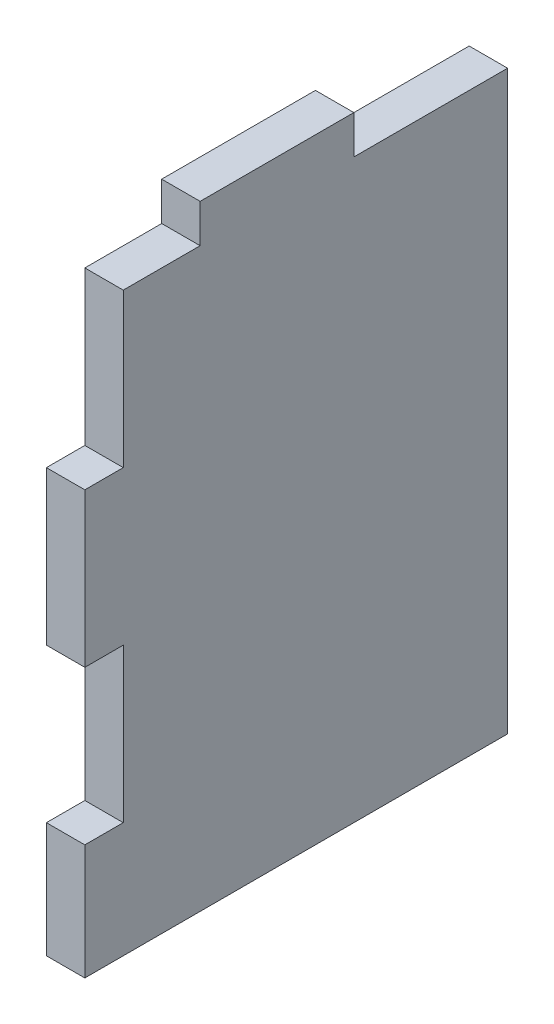
ISO-10303-21;
HEADER;
FILE_DESCRIPTION(('STEP AP214'),'2;1');
FILE_NAME('part.step','',(''),(''),'','','');
FILE_SCHEMA(('AUTOMOTIVE_DESIGN { 1 0 10303 214 1 1 1 1 }'));
ENDSEC;
DATA;
#1=APPLICATION_CONTEXT('core data for automotive mechanical design processes');
#2=APPLICATION_PROTOCOL_DEFINITION('international standard','automotive_design',2000,#1);
#3=PRODUCT_CONTEXT('',#1,'mechanical');
#4=PRODUCT('Part','Part','',(#3));
#5=PRODUCT_RELATED_PRODUCT_CATEGORY('part','',(#4));
#6=PRODUCT_DEFINITION_FORMATION('','',#4);
#7=PRODUCT_DEFINITION_CONTEXT('part definition',#1,'design');
#8=PRODUCT_DEFINITION('design','',#6,#7);
#9=PRODUCT_DEFINITION_SHAPE('','',#8);
#10=(LENGTH_UNIT() NAMED_UNIT(*) SI_UNIT(.MILLI.,.METRE.));
#11=(NAMED_UNIT(*) PLANE_ANGLE_UNIT() SI_UNIT($,.RADIAN.));
#12=(NAMED_UNIT(*) SI_UNIT($,.STERADIAN.) SOLID_ANGLE_UNIT());
#13=UNCERTAINTY_MEASURE_WITH_UNIT(LENGTH_MEASURE(1.E-05),#10,'distance_accuracy_value','');
#14=(GEOMETRIC_REPRESENTATION_CONTEXT(3) GLOBAL_UNCERTAINTY_ASSIGNED_CONTEXT((#13)) GLOBAL_UNIT_ASSIGNED_CONTEXT((#10,
#11,#12)) REPRESENTATION_CONTEXT('',''));
#15=CARTESIAN_POINT('',(0.,0.,0.));
#16=DIRECTION('',(0.,0.,1.));
#17=DIRECTION('',(1.,0.,0.));
#18=AXIS2_PLACEMENT_3D('',#15,#16,#17);
#19=CARTESIAN_POINT('',(3.175,0.,-31.75));
#20=DIRECTION('',(0.,0.,1.));
#21=DIRECTION('',(1.,0.,0.));
#22=AXIS2_PLACEMENT_3D('',#19,#20,#21);
#23=PLANE('',#22);
#24=DIRECTION('',(0.,1.,0.));
#25=VECTOR('',#24,1.);
#26=CARTESIAN_POINT('',(0.,0.,-31.75));
#27=LINE('',#26,#25);
#28=CARTESIAN_POINT('',(0.,0.,-31.75));
#29=VERTEX_POINT('',#28);
#30=CARTESIAN_POINT('',(0.,47.625,-31.75));
#31=VERTEX_POINT('',#30);
#32=EDGE_CURVE('E233',#29,#31,#27,.T.);
#33=ORIENTED_EDGE('',*,*,#32,.T.);
#34=DIRECTION('',(-1.,0.,0.));
#35=VECTOR('',#34,1.);
#36=CARTESIAN_POINT('',(3.175,47.625,-31.75));
#37=LINE('',#36,#35);
#38=CARTESIAN_POINT('',(3.175,47.625,-31.75));
#39=VERTEX_POINT('',#38);
#40=EDGE_CURVE('E167',#39,#31,#37,.T.);
#41=ORIENTED_EDGE('',*,*,#40,.F.);
#42=DIRECTION('',(0.,1.,0.));
#43=VECTOR('',#42,1.);
#44=CARTESIAN_POINT('',(3.175,0.,-31.75));
#45=LINE('',#44,#43);
#46=CARTESIAN_POINT('',(3.175,0.,-31.75));
#47=VERTEX_POINT('',#46);
#48=EDGE_CURVE('E270',#47,#39,#45,.T.);
#49=ORIENTED_EDGE('',*,*,#48,.F.);
#50=DIRECTION('',(-1.,0.,0.));
#51=VECTOR('',#50,1.);
#52=CARTESIAN_POINT('',(3.175,0.,-31.75));
#53=LINE('',#52,#51);
#54=EDGE_CURVE('E163',#47,#29,#53,.T.);
#55=ORIENTED_EDGE('',*,*,#54,.T.);
#56=EDGE_LOOP('',(#33,#41,#49,#55));
#57=FACE_BOUND('',#56,.T.);
#58=ADVANCED_FACE('F83',(#57),#23,.F.);
#59=CARTESIAN_POINT('',(3.175,47.625,0.));
#60=DIRECTION('',(0.,1.,0.));
#61=DIRECTION('',(0.,0.,1.));
#62=AXIS2_PLACEMENT_3D('',#59,#60,#61);
#63=PLANE('',#62);
#64=DIRECTION('',(0.,0.,-1.));
#65=VECTOR('',#64,1.);
#66=CARTESIAN_POINT('',(0.,47.625,0.));
#67=LINE('',#66,#65);
#68=CARTESIAN_POINT('',(0.,47.625,-19.05));
#69=VERTEX_POINT('',#68);
#70=EDGE_CURVE('E229',#69,#31,#67,.T.);
#71=ORIENTED_EDGE('',*,*,#70,.F.);
#72=DIRECTION('',(-1.,0.,0.));
#73=VECTOR('',#72,1.);
#74=CARTESIAN_POINT('',(3.175,47.625,-19.05));
#75=LINE('',#74,#73);
#76=CARTESIAN_POINT('',(3.175,47.625,-19.05));
#77=VERTEX_POINT('',#76);
#78=EDGE_CURVE('E171',#77,#69,#75,.T.);
#79=ORIENTED_EDGE('',*,*,#78,.F.);
#80=DIRECTION('',(0.,0.,-1.));
#81=VECTOR('',#80,1.);
#82=CARTESIAN_POINT('',(3.175,47.625,0.));
#83=LINE('',#82,#81);
#84=EDGE_CURVE('E266',#77,#39,#83,.T.);
#85=ORIENTED_EDGE('',*,*,#84,.T.);
#86=ORIENTED_EDGE('',*,*,#40,.T.);
#87=EDGE_LOOP('',(#71,#79,#85,#86));
#88=FACE_BOUND('',#87,.T.);
#89=ADVANCED_FACE('F348',(#88),#63,.T.);
#90=CARTESIAN_POINT('',(3.175,0.,-19.05));
#91=DIRECTION('',(0.,0.,1.));
#92=DIRECTION('',(1.,0.,0.));
#93=AXIS2_PLACEMENT_3D('',#90,#91,#92);
#94=PLANE('',#93);
#95=DIRECTION('',(0.,1.,0.));
#96=VECTOR('',#95,1.);
#97=CARTESIAN_POINT('',(0.,0.,-19.05));
#98=LINE('',#97,#96);
#99=CARTESIAN_POINT('',(0.,50.8,-19.05));
#100=VERTEX_POINT('',#99);
#101=EDGE_CURVE('E225',#69,#100,#98,.T.);
#102=ORIENTED_EDGE('',*,*,#101,.T.);
#103=DIRECTION('',(-1.,0.,0.));
#104=VECTOR('',#103,1.);
#105=CARTESIAN_POINT('',(3.175,50.8,-19.05));
#106=LINE('',#105,#104);
#107=CARTESIAN_POINT('',(3.175,50.8,-19.05));
#108=VERTEX_POINT('',#107);
#109=EDGE_CURVE('E175',#108,#100,#106,.T.);
#110=ORIENTED_EDGE('',*,*,#109,.F.);
#111=DIRECTION('',(0.,1.,0.));
#112=VECTOR('',#111,1.);
#113=CARTESIAN_POINT('',(3.175,0.,-19.05));
#114=LINE('',#113,#112);
#115=EDGE_CURVE('E262',#77,#108,#114,.T.);
#116=ORIENTED_EDGE('',*,*,#115,.F.);
#117=ORIENTED_EDGE('',*,*,#78,.T.);
#118=EDGE_LOOP('',(#102,#110,#116,#117));
#119=FACE_BOUND('',#118,.T.);
#120=ADVANCED_FACE('F375',(#119),#94,.F.);
#121=CARTESIAN_POINT('',(3.175,50.8,0.));
#122=DIRECTION('',(0.,1.,0.));
#123=DIRECTION('',(0.,0.,1.));
#124=AXIS2_PLACEMENT_3D('',#121,#122,#123);
#125=PLANE('',#124);
#126=DIRECTION('',(0.,0.,-1.));
#127=VECTOR('',#126,1.);
#128=CARTESIAN_POINT('',(0.,50.8,0.));
#129=LINE('',#128,#127);
#130=CARTESIAN_POINT('',(0.,50.8,-6.35));
#131=VERTEX_POINT('',#130);
#132=EDGE_CURVE('E221',#131,#100,#129,.T.);
#133=ORIENTED_EDGE('',*,*,#132,.F.);
#134=DIRECTION('',(-1.,0.,0.));
#135=VECTOR('',#134,1.);
#136=CARTESIAN_POINT('',(3.175,50.8,-6.35));
#137=LINE('',#136,#135);
#138=CARTESIAN_POINT('',(3.175,50.8,-6.35));
#139=VERTEX_POINT('',#138);
#140=EDGE_CURVE('E179',#139,#131,#137,.T.);
#141=ORIENTED_EDGE('',*,*,#140,.F.);
#142=DIRECTION('',(0.,0.,-1.));
#143=VECTOR('',#142,1.);
#144=CARTESIAN_POINT('',(3.175,50.8,0.));
#145=LINE('',#144,#143);
#146=EDGE_CURVE('E258',#139,#108,#145,.T.);
#147=ORIENTED_EDGE('',*,*,#146,.T.);
#148=ORIENTED_EDGE('',*,*,#109,.T.);
#149=EDGE_LOOP('',(#133,#141,#147,#148));
#150=FACE_BOUND('',#149,.T.);
#151=ADVANCED_FACE('F341',(#150),#125,.T.);
#152=CARTESIAN_POINT('',(3.175,0.,-6.35));
#153=DIRECTION('',(0.,0.,1.));
#154=DIRECTION('',(1.,0.,0.));
#155=AXIS2_PLACEMENT_3D('',#152,#153,#154);
#156=PLANE('',#155);
#157=DIRECTION('',(0.,1.,0.));
#158=VECTOR('',#157,1.);
#159=CARTESIAN_POINT('',(0.,0.,-6.35));
#160=LINE('',#159,#158);
#161=CARTESIAN_POINT('',(0.,47.625,-6.35));
#162=VERTEX_POINT('',#161);
#163=EDGE_CURVE('E216',#162,#131,#160,.T.);
#164=ORIENTED_EDGE('',*,*,#163,.F.);
#165=DIRECTION('',(-1.,0.,0.));
#166=VECTOR('',#165,1.);
#167=CARTESIAN_POINT('',(3.175,47.625,-6.35));
#168=LINE('',#167,#166);
#169=CARTESIAN_POINT('',(3.175,47.625,-6.35));
#170=VERTEX_POINT('',#169);
#171=EDGE_CURVE('E183',#170,#162,#168,.T.);
#172=ORIENTED_EDGE('',*,*,#171,.F.);
#173=DIRECTION('',(0.,1.,0.));
#174=VECTOR('',#173,1.);
#175=CARTESIAN_POINT('',(3.175,0.,-6.35));
#176=LINE('',#175,#174);
#177=EDGE_CURVE('E253',#170,#139,#176,.T.);
#178=ORIENTED_EDGE('',*,*,#177,.T.);
#179=ORIENTED_EDGE('',*,*,#140,.T.);
#180=EDGE_LOOP('',(#164,#172,#178,#179));
#181=FACE_BOUND('',#180,.T.);
#182=ADVANCED_FACE('F335',(#181),#156,.T.);
#183=CARTESIAN_POINT('',(0.,47.625,0.));
#184=VERTEX_POINT('',#183);
#185=EDGE_CURVE('E220',#184,#162,#67,.T.);
#186=ORIENTED_EDGE('',*,*,#185,.F.);
#187=DIRECTION('',(-1.,0.,0.));
#188=VECTOR('',#187,1.);
#189=CARTESIAN_POINT('',(3.175,47.625,0.));
#190=LINE('',#189,#188);
#191=CARTESIAN_POINT('',(3.175,47.625,0.));
#192=VERTEX_POINT('',#191);
#193=EDGE_CURVE('E187',#192,#184,#190,.T.);
#194=ORIENTED_EDGE('',*,*,#193,.F.);
#195=EDGE_CURVE('E257',#192,#170,#83,.T.);
#196=ORIENTED_EDGE('',*,*,#195,.T.);
#197=ORIENTED_EDGE('',*,*,#171,.T.);
#198=EDGE_LOOP('',(#186,#194,#196,#197));
#199=FACE_BOUND('',#198,.T.);
#200=ADVANCED_FACE('F327',(#199),#63,.T.);
#201=CARTESIAN_POINT('',(3.175,0.,0.));
#202=DIRECTION('',(0.,0.,1.));
#203=DIRECTION('',(1.,0.,0.));
#204=AXIS2_PLACEMENT_3D('',#201,#202,#203);
#205=PLANE('',#204);
#206=DIRECTION('',(0.,1.,0.));
#207=VECTOR('',#206,1.);
#208=CARTESIAN_POINT('',(0.,0.,0.));
#209=LINE('',#208,#207);
#210=CARTESIAN_POINT('',(0.,34.925,0.));
#211=VERTEX_POINT('',#210);
#212=EDGE_CURVE('E215',#211,#184,#209,.T.);
#213=ORIENTED_EDGE('',*,*,#212,.F.);
#214=DIRECTION('',(1.,0.,0.));
#215=VECTOR('',#214,1.);
#216=CARTESIAN_POINT('',(3.175,34.925,0.));
#217=LINE('',#216,#215);
#218=CARTESIAN_POINT('',(3.175,34.925,0.));
#219=VERTEX_POINT('',#218);
#220=EDGE_CURVE('E12',#211,#219,#217,.T.);
#221=ORIENTED_EDGE('',*,*,#220,.T.);
#222=DIRECTION('',(0.,1.,0.));
#223=VECTOR('',#222,1.);
#224=CARTESIAN_POINT('',(3.175,0.,0.));
#225=LINE('',#224,#223);
#226=EDGE_CURVE('E252',#219,#192,#225,.T.);
#227=ORIENTED_EDGE('',*,*,#226,.T.);
#228=ORIENTED_EDGE('',*,*,#193,.T.);
#229=EDGE_LOOP('',(#213,#221,#227,#228));
#230=FACE_BOUND('',#229,.T.);
#231=ADVANCED_FACE('F320',(#230),#205,.T.);
#232=DIRECTION('',(1.,0.,0.));
#233=VECTOR('',#232,1.);
#234=CARTESIAN_POINT('',(3.175,22.225,0.));
#235=LINE('',#234,#233);
#236=CARTESIAN_POINT('',(0.,22.225,0.));
#237=VERTEX_POINT('',#236);
#238=CARTESIAN_POINT('',(3.175,22.225,0.));
#239=VERTEX_POINT('',#238);
#240=EDGE_CURVE('E94',#237,#239,#235,.T.);
#241=ORIENTED_EDGE('',*,*,#240,.F.);
#242=CARTESIAN_POINT('',(0.,9.525,0.));
#243=VERTEX_POINT('',#242);
#244=EDGE_CURVE('E146',#243,#237,#209,.T.);
#245=ORIENTED_EDGE('',*,*,#244,.F.);
#246=DIRECTION('',(-1.,0.,0.));
#247=VECTOR('',#246,1.);
#248=CARTESIAN_POINT('',(3.175,9.525,0.));
#249=LINE('',#248,#247);
#250=CARTESIAN_POINT('',(3.175,9.525,0.));
#251=VERTEX_POINT('',#250);
#252=EDGE_CURVE('E191',#251,#243,#249,.T.);
#253=ORIENTED_EDGE('',*,*,#252,.F.);
#254=EDGE_CURVE('E248',#251,#239,#225,.T.);
#255=ORIENTED_EDGE('',*,*,#254,.T.);
#256=EDGE_LOOP('',(#241,#245,#253,#255));
#257=FACE_BOUND('',#256,.T.);
#258=ADVANCED_FACE('F371',(#257),#205,.T.);
#259=CARTESIAN_POINT('',(3.175,9.525,0.));
#260=DIRECTION('',(0.,-1.,0.));
#261=DIRECTION('',(0.,0.,-1.));
#262=AXIS2_PLACEMENT_3D('',#259,#260,#261);
#263=PLANE('',#262);
#264=DIRECTION('',(0.,0.,1.));
#265=VECTOR('',#264,1.);
#266=CARTESIAN_POINT('',(0.,9.525,0.));
#267=LINE('',#266,#265);
#268=CARTESIAN_POINT('',(0.,9.525,3.175));
#269=VERTEX_POINT('',#268);
#270=EDGE_CURVE('E209',#243,#269,#267,.T.);
#271=ORIENTED_EDGE('',*,*,#270,.T.);
#272=DIRECTION('',(-1.,0.,0.));
#273=VECTOR('',#272,1.);
#274=CARTESIAN_POINT('',(3.175,9.525,3.175));
#275=LINE('',#274,#273);
#276=CARTESIAN_POINT('',(3.175,9.525,3.175));
#277=VERTEX_POINT('',#276);
#278=EDGE_CURVE('E195',#277,#269,#275,.T.);
#279=ORIENTED_EDGE('',*,*,#278,.F.);
#280=DIRECTION('',(0.,0.,1.));
#281=VECTOR('',#280,1.);
#282=CARTESIAN_POINT('',(3.175,9.525,0.));
#283=LINE('',#282,#281);
#284=EDGE_CURVE('E244',#251,#277,#283,.T.);
#285=ORIENTED_EDGE('',*,*,#284,.F.);
#286=ORIENTED_EDGE('',*,*,#252,.T.);
#287=EDGE_LOOP('',(#271,#279,#285,#286));
#288=FACE_BOUND('',#287,.T.);
#289=ADVANCED_FACE('F366',(#288),#263,.F.);
#290=CARTESIAN_POINT('',(3.175,0.,3.175));
#291=DIRECTION('',(0.,0.,-1.));
#292=DIRECTION('',(0.,1.,0.));
#293=AXIS2_PLACEMENT_3D('',#290,#291,#292);
#294=PLANE('',#293);
#295=DIRECTION('',(0.,-1.,0.));
#296=VECTOR('',#295,1.);
#297=CARTESIAN_POINT('',(0.,0.,3.175));
#298=LINE('',#297,#296);
#299=CARTESIAN_POINT('',(0.,0.,3.175));
#300=VERTEX_POINT('',#299);
#301=EDGE_CURVE('E204',#269,#300,#298,.T.);
#302=ORIENTED_EDGE('',*,*,#301,.T.);
#303=DIRECTION('',(-1.,0.,0.));
#304=VECTOR('',#303,1.);
#305=CARTESIAN_POINT('',(3.175,0.,3.175));
#306=LINE('',#305,#304);
#307=CARTESIAN_POINT('',(3.175,0.,3.175));
#308=VERTEX_POINT('',#307);
#309=EDGE_CURVE('E199',#308,#300,#306,.T.);
#310=ORIENTED_EDGE('',*,*,#309,.F.);
#311=DIRECTION('',(0.,-1.,0.));
#312=VECTOR('',#311,1.);
#313=CARTESIAN_POINT('',(3.175,0.,3.175));
#314=LINE('',#313,#312);
#315=EDGE_CURVE('E203',#277,#308,#314,.T.);
#316=ORIENTED_EDGE('',*,*,#315,.F.);
#317=ORIENTED_EDGE('',*,*,#278,.T.);
#318=EDGE_LOOP('',(#302,#310,#316,#317));
#319=FACE_BOUND('',#318,.T.);
#320=ADVANCED_FACE('F369',(#319),#294,.F.);
#321=CARTESIAN_POINT('',(3.175,0.,0.));
#322=DIRECTION('',(0.,1.,0.));
#323=DIRECTION('',(0.,0.,1.));
#324=AXIS2_PLACEMENT_3D('',#321,#322,#323);
#325=PLANE('',#324);
#326=DIRECTION('',(0.,0.,-1.));
#327=VECTOR('',#326,1.);
#328=CARTESIAN_POINT('',(0.,0.,0.));
#329=LINE('',#328,#327);
#330=EDGE_CURVE('E237',#300,#29,#329,.T.);
#331=ORIENTED_EDGE('',*,*,#330,.T.);
#332=ORIENTED_EDGE('',*,*,#54,.F.);
#333=DIRECTION('',(0.,0.,-1.));
#334=VECTOR('',#333,1.);
#335=CARTESIAN_POINT('',(3.175,0.,0.));
#336=LINE('',#335,#334);
#337=EDGE_CURVE('E208',#308,#47,#336,.T.);
#338=ORIENTED_EDGE('',*,*,#337,.F.);
#339=ORIENTED_EDGE('',*,*,#309,.T.);
#340=EDGE_LOOP('',(#331,#332,#338,#339));
#341=FACE_BOUND('',#340,.T.);
#342=ADVANCED_FACE('F291',(#341),#325,.F.);
#343=CARTESIAN_POINT('',(0.,0.,0.));
#344=DIRECTION('',(1.,0.,0.));
#345=DIRECTION('',(0.,0.,-1.));
#346=AXIS2_PLACEMENT_3D('',#343,#344,#345);
#347=PLANE('',#346);
#348=ORIENTED_EDGE('',*,*,#330,.F.);
#349=ORIENTED_EDGE('',*,*,#301,.F.);
#350=ORIENTED_EDGE('',*,*,#270,.F.);
#351=ORIENTED_EDGE('',*,*,#244,.T.);
#352=DIRECTION('',(0.,0.,1.));
#353=VECTOR('',#352,1.);
#354=CARTESIAN_POINT('',(0.,22.225,0.));
#355=LINE('',#354,#353);
#356=CARTESIAN_POINT('',(0.,22.225,3.175));
#357=VERTEX_POINT('',#356);
#358=EDGE_CURVE('E130',#237,#357,#355,.T.);
#359=ORIENTED_EDGE('',*,*,#358,.T.);
#360=DIRECTION('',(0.,-1.,0.));
#361=VECTOR('',#360,1.);
#362=CARTESIAN_POINT('',(0.,34.925,3.175));
#363=LINE('',#362,#361);
#364=CARTESIAN_POINT('',(0.,34.925,3.175));
#365=VERTEX_POINT('',#364);
#366=EDGE_CURVE('E120',#365,#357,#363,.T.);
#367=ORIENTED_EDGE('',*,*,#366,.F.);
#368=DIRECTION('',(0.,0.,1.));
#369=VECTOR('',#368,1.);
#370=CARTESIAN_POINT('',(0.,34.925,0.));
#371=LINE('',#370,#369);
#372=EDGE_CURVE('E140',#211,#365,#371,.T.);
#373=ORIENTED_EDGE('',*,*,#372,.F.);
#374=ORIENTED_EDGE('',*,*,#212,.T.);
#375=ORIENTED_EDGE('',*,*,#185,.T.);
#376=ORIENTED_EDGE('',*,*,#163,.T.);
#377=ORIENTED_EDGE('',*,*,#132,.T.);
#378=ORIENTED_EDGE('',*,*,#101,.F.);
#379=ORIENTED_EDGE('',*,*,#70,.T.);
#380=ORIENTED_EDGE('',*,*,#32,.F.);
#381=EDGE_LOOP('',(#348,#349,#350,#351,#359,#367,#373,#374,#375,#376,#377,#378,#379,#380));
#382=FACE_BOUND('',#381,.T.);
#383=ADVANCED_FACE('F143',(#382),#347,.F.);
#384=CARTESIAN_POINT('',(3.175,0.,0.));
#385=DIRECTION('',(1.,0.,0.));
#386=DIRECTION('',(0.,0.,-1.));
#387=AXIS2_PLACEMENT_3D('',#384,#385,#386);
#388=PLANE('',#387);
#389=ORIENTED_EDGE('',*,*,#337,.T.);
#390=ORIENTED_EDGE('',*,*,#48,.T.);
#391=ORIENTED_EDGE('',*,*,#84,.F.);
#392=ORIENTED_EDGE('',*,*,#115,.T.);
#393=ORIENTED_EDGE('',*,*,#146,.F.);
#394=ORIENTED_EDGE('',*,*,#177,.F.);
#395=ORIENTED_EDGE('',*,*,#195,.F.);
#396=ORIENTED_EDGE('',*,*,#226,.F.);
#397=DIRECTION('',(0.,0.,1.));
#398=VECTOR('',#397,1.);
#399=CARTESIAN_POINT('',(3.175,34.925,0.));
#400=LINE('',#399,#398);
#401=CARTESIAN_POINT('',(3.175,34.925,3.175));
#402=VERTEX_POINT('',#401);
#403=EDGE_CURVE('E148',#219,#402,#400,.T.);
#404=ORIENTED_EDGE('',*,*,#403,.T.);
#405=DIRECTION('',(0.,-1.,0.));
#406=VECTOR('',#405,1.);
#407=CARTESIAN_POINT('',(3.175,34.925,3.175));
#408=LINE('',#407,#406);
#409=CARTESIAN_POINT('',(3.175,22.225,3.175));
#410=VERTEX_POINT('',#409);
#411=EDGE_CURVE('E152',#402,#410,#408,.T.);
#412=ORIENTED_EDGE('',*,*,#411,.T.);
#413=DIRECTION('',(0.,0.,1.));
#414=VECTOR('',#413,1.);
#415=CARTESIAN_POINT('',(3.175,22.225,0.));
#416=LINE('',#415,#414);
#417=EDGE_CURVE('E133',#239,#410,#416,.T.);
#418=ORIENTED_EDGE('',*,*,#417,.F.);
#419=ORIENTED_EDGE('',*,*,#254,.F.);
#420=ORIENTED_EDGE('',*,*,#284,.T.);
#421=ORIENTED_EDGE('',*,*,#315,.T.);
#422=EDGE_LOOP('',(#389,#390,#391,#392,#393,#394,#395,#396,#404,#412,#418,#419,#420,#421));
#423=FACE_BOUND('',#422,.T.);
#424=ADVANCED_FACE('F280',(#423),#388,.T.);
#425=CARTESIAN_POINT('',(3.175,34.925,3.175));
#426=DIRECTION('',(0.,0.,-1.));
#427=DIRECTION('',(0.,1.,0.));
#428=AXIS2_PLACEMENT_3D('',#425,#426,#427);
#429=PLANE('',#428);
#430=ORIENTED_EDGE('',*,*,#366,.T.);
#431=DIRECTION('',(-1.,0.,0.));
#432=VECTOR('',#431,1.);
#433=CARTESIAN_POINT('',(3.175,22.225,3.175));
#434=LINE('',#433,#432);
#435=EDGE_CURVE('E127',#410,#357,#434,.T.);
#436=ORIENTED_EDGE('',*,*,#435,.F.);
#437=ORIENTED_EDGE('',*,*,#411,.F.);
#438=DIRECTION('',(-1.,0.,0.));
#439=VECTOR('',#438,1.);
#440=CARTESIAN_POINT('',(3.175,34.925,3.175));
#441=LINE('',#440,#439);
#442=EDGE_CURVE('E87',#402,#365,#441,.T.);
#443=ORIENTED_EDGE('',*,*,#442,.T.);
#444=EDGE_LOOP('',(#430,#436,#437,#443));
#445=FACE_BOUND('',#444,.T.);
#446=ADVANCED_FACE('F136',(#445),#429,.F.);
#447=CARTESIAN_POINT('',(3.175,22.225,0.));
#448=DIRECTION('',(0.,-1.,0.));
#449=DIRECTION('',(0.,0.,-1.));
#450=AXIS2_PLACEMENT_3D('',#447,#448,#449);
#451=PLANE('',#450);
#452=ORIENTED_EDGE('',*,*,#358,.F.);
#453=ORIENTED_EDGE('',*,*,#240,.T.);
#454=ORIENTED_EDGE('',*,*,#417,.T.);
#455=ORIENTED_EDGE('',*,*,#435,.T.);
#456=EDGE_LOOP('',(#452,#453,#454,#455));
#457=FACE_BOUND('',#456,.T.);
#458=ADVANCED_FACE('F128',(#457),#451,.T.);
#459=CARTESIAN_POINT('',(3.175,34.925,0.));
#460=DIRECTION('',(0.,-1.,0.));
#461=DIRECTION('',(0.,0.,-1.));
#462=AXIS2_PLACEMENT_3D('',#459,#460,#461);
#463=PLANE('',#462);
#464=ORIENTED_EDGE('',*,*,#372,.T.);
#465=ORIENTED_EDGE('',*,*,#442,.F.);
#466=ORIENTED_EDGE('',*,*,#403,.F.);
#467=ORIENTED_EDGE('',*,*,#220,.F.);
#468=EDGE_LOOP('',(#464,#465,#466,#467));
#469=FACE_BOUND('',#468,.T.);
#470=ADVANCED_FACE('F85',(#469),#463,.F.);
#471=CLOSED_SHELL('',(#58,#89,#120,#151,#182,#200,#231,#258,#289,#320,#342,#383,#424,#446,#458,#470));
#472=MANIFOLD_SOLID_BREP('B2',#471);
#473=ADVANCED_BREP_SHAPE_REPRESENTATION('',(#18,#472),#14);
#474=SHAPE_DEFINITION_REPRESENTATION(#9,#473);
ENDSEC;
END-ISO-10303-21;
